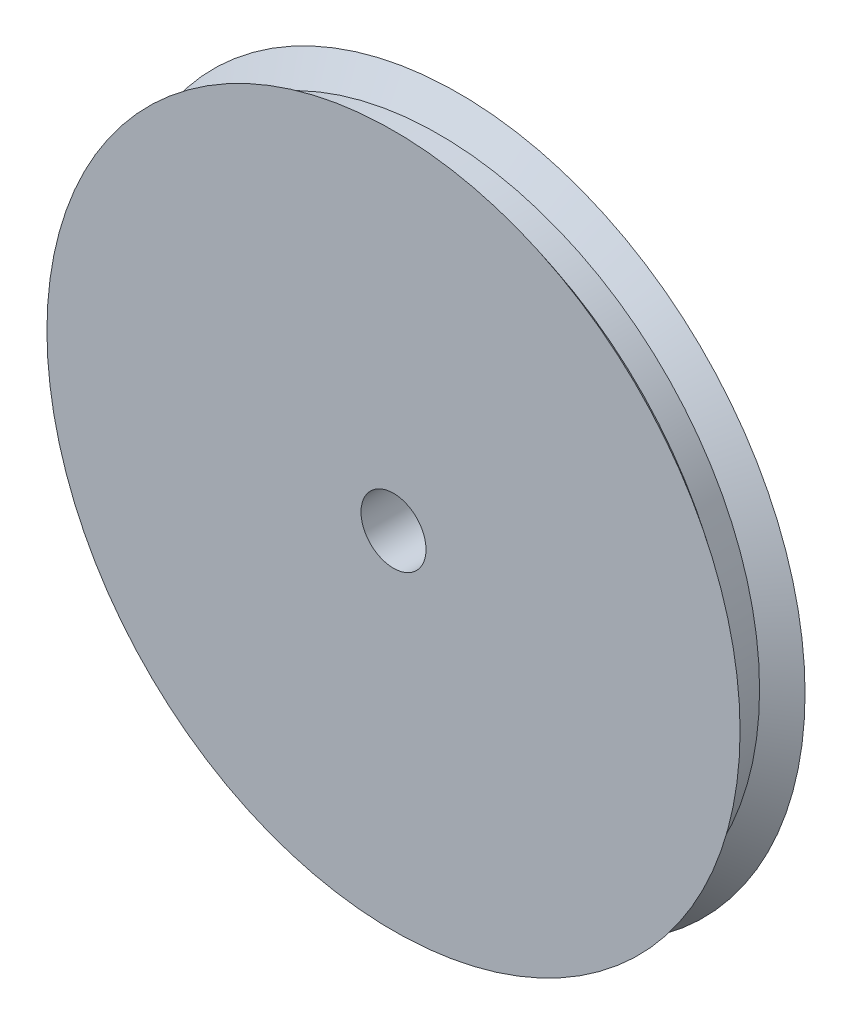
ISO-10303-21;
HEADER;
FILE_DESCRIPTION(('STEP AP214'),'2;1');
FILE_NAME('part.step','',(''),(''),'','','');
FILE_SCHEMA(('AUTOMOTIVE_DESIGN { 1 0 10303 214 1 1 1 1 }'));
ENDSEC;
DATA;
#1=APPLICATION_CONTEXT('core data for automotive mechanical design processes');
#2=APPLICATION_PROTOCOL_DEFINITION('international standard','automotive_design',2000,#1);
#3=PRODUCT_CONTEXT('',#1,'mechanical');
#4=PRODUCT('Part','Part','',(#3));
#5=PRODUCT_RELATED_PRODUCT_CATEGORY('part','',(#4));
#6=PRODUCT_DEFINITION_FORMATION('','',#4);
#7=PRODUCT_DEFINITION_CONTEXT('part definition',#1,'design');
#8=PRODUCT_DEFINITION('design','',#6,#7);
#9=PRODUCT_DEFINITION_SHAPE('','',#8);
#10=(LENGTH_UNIT() NAMED_UNIT(*) SI_UNIT(.MILLI.,.METRE.));
#11=(NAMED_UNIT(*) PLANE_ANGLE_UNIT() SI_UNIT($,.RADIAN.));
#12=(NAMED_UNIT(*) SI_UNIT($,.STERADIAN.) SOLID_ANGLE_UNIT());
#13=UNCERTAINTY_MEASURE_WITH_UNIT(LENGTH_MEASURE(1.E-05),#10,'distance_accuracy_value','');
#14=(GEOMETRIC_REPRESENTATION_CONTEXT(3) GLOBAL_UNCERTAINTY_ASSIGNED_CONTEXT((#13)) GLOBAL_UNIT_ASSIGNED_CONTEXT((#10,
#11,#12)) REPRESENTATION_CONTEXT('',''));
#15=CARTESIAN_POINT('',(0.,0.,0.));
#16=DIRECTION('',(0.,0.,1.));
#17=DIRECTION('',(1.,0.,0.));
#18=AXIS2_PLACEMENT_3D('',#15,#16,#17);
#19=CARTESIAN_POINT('',(0.,0.,0.));
#20=DIRECTION('',(0.,0.,1.));
#21=DIRECTION('',(1.,0.,0.));
#22=AXIS2_PLACEMENT_3D('',#19,#20,#21);
#23=PLANE('',#22);
#24=CARTESIAN_POINT('',(0.,0.,0.));
#25=DIRECTION('',(0.,0.,-1.));
#26=DIRECTION('',(-1.,0.,0.));
#27=AXIS2_PLACEMENT_3D('',#24,#25,#26);
#28=CIRCLE('',#27,101.6);
#29=CARTESIAN_POINT('',(-101.6,0.,0.));
#30=VERTEX_POINT('',#29);
#31=EDGE_CURVE('E40',#30,#30,#28,.T.);
#32=ORIENTED_EDGE('',*,*,#31,.T.);
#33=EDGE_LOOP('',(#32));
#34=FACE_BOUND('',#33,.T.);
#35=CARTESIAN_POINT('',(0.,0.,0.));
#36=DIRECTION('',(0.,0.,1.));
#37=DIRECTION('',(1.,0.,0.));
#38=AXIS2_PLACEMENT_3D('',#35,#36,#37);
#39=CIRCLE('',#38,15.24);
#40=CARTESIAN_POINT('',(15.24,0.,0.));
#41=VERTEX_POINT('',#40);
#42=EDGE_CURVE('E10',#41,#41,#39,.F.);
#43=ORIENTED_EDGE('',*,*,#42,.F.);
#44=EDGE_LOOP('',(#43));
#45=FACE_BOUND('',#44,.T.);
#46=ADVANCED_FACE('F30',(#34,#45),#23,.F.);
#47=CARTESIAN_POINT('',(0.,0.,19.05));
#48=DIRECTION('',(0.,0.,1.));
#49=DIRECTION('',(1.,0.,0.));
#50=AXIS2_PLACEMENT_3D('',#47,#48,#49);
#51=PLANE('',#50);
#52=CARTESIAN_POINT('',(0.,0.,19.05));
#53=DIRECTION('',(0.,0.,-1.));
#54=DIRECTION('',(-1.,0.,0.));
#55=AXIS2_PLACEMENT_3D('',#52,#53,#54);
#56=CIRCLE('',#55,101.6);
#57=CARTESIAN_POINT('',(-101.6,0.,19.05));
#58=VERTEX_POINT('',#57);
#59=EDGE_CURVE('E44',#58,#58,#56,.T.);
#60=ORIENTED_EDGE('',*,*,#59,.F.);
#61=EDGE_LOOP('',(#60));
#62=FACE_BOUND('',#61,.T.);
#63=CARTESIAN_POINT('',(0.,0.,19.05));
#64=DIRECTION('',(0.,0.,1.));
#65=DIRECTION('',(1.,0.,0.));
#66=AXIS2_PLACEMENT_3D('',#63,#64,#65);
#67=CIRCLE('',#66,9.525);
#68=CARTESIAN_POINT('',(9.525,0.,19.05));
#69=VERTEX_POINT('',#68);
#70=EDGE_CURVE('E36',#69,#69,#67,.T.);
#71=ORIENTED_EDGE('',*,*,#70,.F.);
#72=EDGE_LOOP('',(#71));
#73=FACE_BOUND('',#72,.T.);
#74=ADVANCED_FACE('F102',(#62,#73),#51,.T.);
#75=CARTESIAN_POINT('',(0.,0.,19.05));
#76=DIRECTION('',(0.,0.,-1.));
#77=DIRECTION('',(-1.,0.,0.));
#78=AXIS2_PLACEMENT_3D('',#75,#76,#77);
#79=CYLINDRICAL_SURFACE('',#78,9.525);
#80=CARTESIAN_POINT('',(9.52500000000003,0.,-4.445));
#81=CARTESIAN_POINT('',(9.52499895696519,0.0709986106499954,-4.44499700933611));
#82=CARTESIAN_POINT('',(9.52419780911769,0.142040596840437,-4.43902621339383));
#83=CARTESIAN_POINT('',(9.52107894565584,0.28214493046268,-4.41530336835353));
#84=CARTESIAN_POINT('',(9.51875968000494,0.351205179181478,-4.39753927774031));
#85=CARTESIAN_POINT('',(9.51286565704157,0.485297678518134,-4.35076490936118));
#86=CARTESIAN_POINT('',(9.50929177773968,0.550332708742143,-4.32176249499059));
#87=CARTESIAN_POINT('',(9.50128520529349,0.674601073344239,-4.25335260973301));
#88=CARTESIAN_POINT('',(9.49685265064689,0.73383534102401,-4.2139468164593));
#89=CARTESIAN_POINT('',(9.48759211691627,0.845201397290471,-4.12558657888135));
#90=CARTESIAN_POINT('',(9.48276207432941,0.897291820789873,-4.07658021041962));
#91=CARTESIAN_POINT('',(9.47326742349298,0.992535071524196,-3.97052152993633));
#92=CARTESIAN_POINT('',(9.46860282401087,1.03568742568235,-3.91346879230266));
#93=CARTESIAN_POINT('',(9.4599470150452,1.11198597940756,-3.79266505692991));
#94=CARTESIAN_POINT('',(9.45595846781259,1.14509300751437,-3.72888911162608));
#95=CARTESIAN_POINT('',(9.44913392985812,1.20011091579629,-3.59662027230464));
#96=CARTESIAN_POINT('',(9.44629788950517,1.22202227810751,-3.52812758155565));
#97=CARTESIAN_POINT('',(9.44211939721104,1.2539002530033,-3.38880081033145));
#98=CARTESIAN_POINT('',(9.44076817310036,1.26393704685102,-3.3179830550716));
#99=CARTESIAN_POINT('',(9.43968553771915,1.27199822148054,-3.17565647595022));
#100=CARTESIAN_POINT('',(9.43995405261954,1.27002314977337,-3.10414768373508));
#101=CARTESIAN_POINT('',(9.44207252915848,1.25417418671414,-2.96296008243226));
#102=CARTESIAN_POINT('',(9.44391218035188,1.24037786932669,-2.89327238852258));
#103=CARTESIAN_POINT('',(9.44894956011963,1.20139920142826,-2.75721010865734));
#104=CARTESIAN_POINT('',(9.45214731965871,1.17621659131025,-2.69083559828057));
#105=CARTESIAN_POINT('',(9.45955220805502,1.11509765005926,-2.56304438196093));
#106=CARTESIAN_POINT('',(9.46376246768676,1.07912787675231,-2.50164385929162));
#107=CARTESIAN_POINT('',(9.47271559999658,0.997479547736237,-2.38572098298229));
#108=CARTESIAN_POINT('',(9.47745850036341,0.951800487190145,-2.3311989872281));
#109=CARTESIAN_POINT('',(9.48698826013327,0.851601611667402,-2.2301307870105));
#110=CARTESIAN_POINT('',(9.4917751714866,0.797014983961793,-2.18365079988402));
#111=CARTESIAN_POINT('',(9.50081871624597,0.680779798034714,-2.10050250147047));
#112=CARTESIAN_POINT('',(9.50507534812444,0.619131219470905,-2.06383421844756));
#113=CARTESIAN_POINT('',(9.51258190027173,0.490469059528849,-2.00134911026384));
#114=CARTESIAN_POINT('',(9.51583140777688,0.423453292564182,-1.97553673278559));
#115=CARTESIAN_POINT('',(9.52095394449085,0.285985536953519,-1.93555028245256));
#116=CARTESIAN_POINT('',(9.52282704708105,0.215533731709334,-1.92137558914398));
#117=CARTESIAN_POINT('',(9.52497613274304,0.0737659836117845,-1.90515339519034));
#118=CARTESIAN_POINT('',(9.52526412094144,0.00246064693737275,-1.90301473486749));
#119=CARTESIAN_POINT('',(9.5242430262696,-0.139491476933885,-1.91068430672076));
#120=CARTESIAN_POINT('',(9.5229339822156,-0.210138280094496,-1.9204922485318));
#121=CARTESIAN_POINT('',(9.51887336352394,-0.348496709388815,-1.95170085489883));
#122=CARTESIAN_POINT('',(9.51612723582355,-0.416218380485148,-1.97305775588456));
#123=CARTESIAN_POINT('',(9.50949970876473,-0.54711923773391,-2.02671233337005));
#124=CARTESIAN_POINT('',(9.50561826609044,-0.610298250454929,-2.05901042731841));
#125=CARTESIAN_POINT('',(9.49712246729997,-0.730725537921209,-2.1338490187954));
#126=CARTESIAN_POINT('',(9.49250397054029,-0.787937092141843,-2.17644812722797));
#127=CARTESIAN_POINT('',(9.48306287730839,-0.894431121339854,-2.2705970140574));
#128=CARTESIAN_POINT('',(9.47824027157794,-0.943713236156103,-2.32214719879793));
#129=CARTESIAN_POINT('',(9.46889713070679,-1.03327548883667,-2.43313784557611));
#130=CARTESIAN_POINT('',(9.46437876472314,-1.07349498031676,-2.49262745487873));
#131=CARTESIAN_POINT('',(9.45619224456154,-1.14337052935047,-2.61757122552839));
#132=CARTESIAN_POINT('',(9.45252407139858,-1.1730268227907,-2.68302525364309));
#133=CARTESIAN_POINT('',(9.4464683548035,-1.22083726177974,-2.81784884868758));
#134=CARTESIAN_POINT('',(9.444077087377,-1.23902488317715,-2.88720637010886));
#135=CARTESIAN_POINT('',(9.44083550423415,-1.26348913636414,-3.02802520640176));
#136=CARTESIAN_POINT('',(9.43998510609402,-1.26976640526006,-3.09948640853602));
#137=CARTESIAN_POINT('',(9.43992416872609,-1.2702189848693,-3.24188041669198));
#138=CARTESIAN_POINT('',(9.440700716494,-1.26448959188503,-3.31281293301229));
#139=CARTESIAN_POINT('',(9.44377831760116,-1.24129404196048,-3.45269685069096));
#140=CARTESIAN_POINT('',(9.44607937036908,-1.22382788941876,-3.52164825279175));
#141=CARTESIAN_POINT('',(9.45194255323205,-1.17768567060952,-3.65559573886476));
#142=CARTESIAN_POINT('',(9.45550409288719,-1.14901485220091,-3.72059365805921));
#143=CARTESIAN_POINT('',(9.46348784027642,-1.08128652652433,-3.84487158622955));
#144=CARTESIAN_POINT('',(9.46791006462843,-1.04222881870322,-3.90415148477009));
#145=CARTESIAN_POINT('',(9.47715889161244,-0.954484048035378,-4.01579692770454));
#146=CARTESIAN_POINT('',(9.48198831153842,-0.905726072890822,-4.06810651182451));
#147=CARTESIAN_POINT('',(9.49148291566056,-0.800113775371381,-4.16383674238958));
#148=CARTESIAN_POINT('',(9.49614806106301,-0.743257556363409,-4.20725530070641));
#149=CARTESIAN_POINT('',(9.50481103312331,-0.622778147286544,-4.28413363292624));
#150=CARTESIAN_POINT('',(9.50880588981075,-0.55912678417242,-4.31754957326258));
#151=CARTESIAN_POINT('',(9.51564848618447,-0.427096180087956,-4.37316918007612));
#152=CARTESIAN_POINT('',(9.51849745346939,-0.358722091145881,-4.39538485197679));
#153=CARTESIAN_POINT('',(9.52205183306974,-0.241673639142497,-4.42274198405459));
#154=CARTESIAN_POINT('',(9.52315191908271,-0.19373283704192,-4.43107650963751));
#155=CARTESIAN_POINT('',(9.5246263564164,-0.0972014639762312,-4.44220651699508));
#156=CARTESIAN_POINT('',(9.52500071413881,-0.0486108987465377,-4.44500204762964));
#157=CARTESIAN_POINT('',(9.52500000000003,0.,-4.445));
#158=B_SPLINE_CURVE_WITH_KNOTS('',3,(#80,#81,#82,#83,#84,#85,#86,#87,#88,#89,#90,#91,#92,#93,
#94,#95,#96,#97,#98,#99,#100,#101,#102,#103,#104,#105,#106,#107,#108,#109,#110,#111,#112,#113,
#114,#115,#116,#117,#118,#119,#120,#121,#122,#123,#124,#125,#126,#127,#128,#129,#130,#131,#132,
#133,#134,#135,#136,#137,#138,#139,#140,#141,#142,#143,#144,#145,#146,#147,#148,#149,#150,#151,
#152,#153,#154,#155,#156,#157),.UNSPECIFIED.,.T.,.F.,(4,2,2,2,2,2,2,2,2,2,2,2,2,2,2,2,2,2,2,2,2,
2,2,2,2,2,2,2,2,2,2,2,2,2,2,2,2,2,4),(0.,0.212818250579147,0.425854133612003,0.638741224945402,
0.851594007781619,1.0656314631166,1.27968024419571,1.49455328159896,1.7094170648154,
1.92300451005618,2.13658221987324,2.34876902037258,2.56096065896665,2.77381705292565,
2.98668451711811,3.20122895747879,3.41577401586208,3.63040688828612,3.84502831698757,
4.05802201469959,4.27101053565094,4.48319755756754,4.69539267614752,4.90882479478876,
5.12226660494314,5.33709692380011,5.55192244498386,5.76611797457013,5.98030204612608,
6.19279258960356,6.40528305344653,6.61767411351165,6.83006927478398,7.04407829075293,
7.25813751094487,7.47312149438318,7.68787454670186,7.83358694295041,7.97929805385254),.UNSPECIFIED.);
#159=CARTESIAN_POINT('',(9.52500000000003,0.,-4.445));
#160=VERTEX_POINT('',#159);
#161=EDGE_CURVE('E61',#160,#160,#158,.T.);
#162=ORIENTED_EDGE('',*,*,#161,.T.);
#163=EDGE_LOOP('',(#162));
#164=FACE_BOUND('',#163,.T.);
#165=ORIENTED_EDGE('',*,*,#70,.T.);
#166=EDGE_LOOP('',(#165));
#167=FACE_BOUND('',#166,.T.);
#168=CARTESIAN_POINT('',(0.,0.,-6.35));
#169=DIRECTION('',(0.,0.,-1.));
#170=DIRECTION('',(-1.,0.,0.));
#171=AXIS2_PLACEMENT_3D('',#168,#169,#170);
#172=CIRCLE('',#171,9.525);
#173=CARTESIAN_POINT('',(-9.525,0.,-6.35));
#174=VERTEX_POINT('',#173);
#175=EDGE_CURVE('E58',#174,#174,#172,.T.);
#176=ORIENTED_EDGE('',*,*,#175,.T.);
#177=EDGE_LOOP('',(#176));
#178=FACE_BOUND('',#177,.T.);
#179=ADVANCED_FACE('F99',(#164,#167,#178),#79,.F.);
#180=CARTESIAN_POINT('',(0.,0.,0.));
#181=DIRECTION('',(0.,0.,-1.));
#182=DIRECTION('',(-1.,0.,0.));
#183=AXIS2_PLACEMENT_3D('',#180,#181,#182);
#184=CONICAL_SURFACE('',#183,101.6,0.927295218001612);
#185=CARTESIAN_POINT('',(0.,0.,5.715));
#186=DIRECTION('',(0.,0.,-1.));
#187=DIRECTION('',(-1.,0.,0.));
#188=AXIS2_PLACEMENT_3D('',#185,#186,#187);
#189=CIRCLE('',#188,93.98);
#190=CARTESIAN_POINT('',(-93.98,0.,5.715));
#191=VERTEX_POINT('',#190);
#192=EDGE_CURVE('E52',#191,#191,#189,.T.);
#193=ORIENTED_EDGE('',*,*,#192,.T.);
#194=EDGE_LOOP('',(#193));
#195=FACE_BOUND('',#194,.T.);
#196=ORIENTED_EDGE('',*,*,#31,.F.);
#197=EDGE_LOOP('',(#196));
#198=FACE_BOUND('',#197,.T.);
#199=ADVANCED_FACE('F95',(#195,#198),#184,.T.);
#200=CARTESIAN_POINT('',(0.,0.,19.05));
#201=DIRECTION('',(0.,0.,1.));
#202=DIRECTION('',(1.,0.,0.));
#203=AXIS2_PLACEMENT_3D('',#200,#201,#202);
#204=CONICAL_SURFACE('',#203,101.6,0.927295218001612);
#205=CARTESIAN_POINT('',(0.,0.,13.335));
#206=DIRECTION('',(0.,0.,-1.));
#207=DIRECTION('',(-1.,0.,0.));
#208=AXIS2_PLACEMENT_3D('',#205,#206,#207);
#209=CIRCLE('',#208,93.98);
#210=CARTESIAN_POINT('',(-93.98,0.,13.335));
#211=VERTEX_POINT('',#210);
#212=EDGE_CURVE('E49',#211,#211,#209,.T.);
#213=ORIENTED_EDGE('',*,*,#212,.F.);
#214=EDGE_LOOP('',(#213));
#215=FACE_BOUND('',#214,.T.);
#216=ORIENTED_EDGE('',*,*,#59,.T.);
#217=EDGE_LOOP('',(#216));
#218=FACE_BOUND('',#217,.T.);
#219=ADVANCED_FACE('F91',(#215,#218),#204,.T.);
#220=CARTESIAN_POINT('',(0.,0.,0.));
#221=DIRECTION('',(0.,0.,-1.));
#222=DIRECTION('',(-1.,0.,0.));
#223=AXIS2_PLACEMENT_3D('',#220,#221,#222);
#224=CYLINDRICAL_SURFACE('',#223,93.98);
#225=ORIENTED_EDGE('',*,*,#192,.F.);
#226=EDGE_LOOP('',(#225));
#227=FACE_BOUND('',#226,.T.);
#228=ORIENTED_EDGE('',*,*,#212,.T.);
#229=EDGE_LOOP('',(#228));
#230=FACE_BOUND('',#229,.T.);
#231=ADVANCED_FACE('F84',(#227,#230),#224,.T.);
#232=CARTESIAN_POINT('',(0.,0.,-6.35));
#233=DIRECTION('',(0.,0.,-1.));
#234=DIRECTION('',(-1.,0.,0.));
#235=AXIS2_PLACEMENT_3D('',#232,#233,#234);
#236=PLANE('',#235);
#237=CARTESIAN_POINT('',(0.,0.,-6.35));
#238=DIRECTION('',(0.,0.,-1.));
#239=DIRECTION('',(-1.,0.,0.));
#240=AXIS2_PLACEMENT_3D('',#237,#238,#239);
#241=CIRCLE('',#240,15.24);
#242=CARTESIAN_POINT('',(-15.24,0.,-6.35));
#243=VERTEX_POINT('',#242);
#244=EDGE_CURVE('E55',#243,#243,#241,.T.);
#245=ORIENTED_EDGE('',*,*,#244,.T.);
#246=EDGE_LOOP('',(#245));
#247=FACE_BOUND('',#246,.T.);
#248=ORIENTED_EDGE('',*,*,#175,.F.);
#249=EDGE_LOOP('',(#248));
#250=FACE_BOUND('',#249,.T.);
#251=ADVANCED_FACE('F80',(#247,#250),#236,.T.);
#252=CARTESIAN_POINT('',(0.,0.,-6.35));
#253=DIRECTION('',(0.,0.,1.));
#254=DIRECTION('',(1.,0.,0.));
#255=AXIS2_PLACEMENT_3D('',#252,#253,#254);
#256=CYLINDRICAL_SURFACE('',#255,15.24);
#257=CARTESIAN_POINT('',(15.24,0.,-4.445));
#258=CARTESIAN_POINT('',(15.2399993067263,0.0712039341999295,-4.44499688999063));
#259=CARTESIAN_POINT('',(15.2394956645011,0.142456340918887,-4.43899166833997));
#260=CARTESIAN_POINT('',(15.2375349595688,0.282989744789495,-4.41512407314405));
#261=CARTESIAN_POINT('',(15.2360768167325,0.352268415636042,-4.39724826631277));
#262=CARTESIAN_POINT('',(15.2323718878255,0.486798648593112,-4.3501600146621));
#263=CARTESIAN_POINT('',(15.2301255480508,0.552052465139262,-4.32095398430053));
#264=CARTESIAN_POINT('',(15.2250961403578,0.676715986438417,-4.25204581152257));
#265=CARTESIAN_POINT('',(15.2223131872832,0.736126937554444,-4.21234591428356));
#266=CARTESIAN_POINT('',(15.2165149043072,0.847585299956301,-4.12346766541039));
#267=CARTESIAN_POINT('',(15.2134990634995,0.899615767968525,-4.07426809740168));
#268=CARTESIAN_POINT('',(15.2075791962002,0.994690839591424,-3.96783192227058));
#269=CARTESIAN_POINT('',(15.2046751746254,1.03773504844181,-3.91059496225567));
#270=CARTESIAN_POINT('',(15.1993022487978,1.11367306143559,-3.78960619128423));
#271=CARTESIAN_POINT('',(15.1968339849872,1.14655197784846,-3.72584500523848));
#272=CARTESIAN_POINT('',(15.1926178804931,1.20113099089278,-3.5936830646439));
#273=CARTESIAN_POINT('',(15.1908700270845,1.22283128498077,-3.52528239207002));
#274=CARTESIAN_POINT('',(15.1882969292423,1.25438792786959,-3.3859528523109));
#275=CARTESIAN_POINT('',(15.18746953529,1.26427187504501,-3.3150302762094));
#276=CARTESIAN_POINT('',(15.1868242404827,1.27200051417959,-3.17252832098939));
#277=CARTESIAN_POINT('',(15.1870063206823,1.26984543208401,-3.10094895422253));
#278=CARTESIAN_POINT('',(15.1883574484928,1.25357999755286,-2.95935442480164));
#279=CARTESIAN_POINT('',(15.1895240198987,1.23949963940833,-2.88933578967296));
#280=CARTESIAN_POINT('',(15.1927088013309,1.19982994143633,-2.75265912841095));
#281=CARTESIAN_POINT('',(15.1947270196749,1.17424048920392,-2.68600113510681));
#282=CARTESIAN_POINT('',(15.199390539777,1.11224541095308,-2.55784234953482));
#283=CARTESIAN_POINT('',(15.2020366208972,1.07582632784164,-2.49634809646386));
#284=CARTESIAN_POINT('',(15.2076569971713,0.993215493769953,-2.38033389969885));
#285=CARTESIAN_POINT('',(15.2106312989716,0.947023544890628,-2.32581409728654));
#286=CARTESIAN_POINT('',(15.2165839992279,0.846009969427481,-2.22512201751241));
#287=CARTESIAN_POINT('',(15.2195623824433,0.791162412326031,-2.17897574855585));
#288=CARTESIAN_POINT('',(15.2251789967469,0.674485006592124,-2.09654175129654));
#289=CARTESIAN_POINT('',(15.2278172276077,0.612655153294479,-2.06025402958078));
#290=CARTESIAN_POINT('',(15.2324567817824,0.483751373450171,-1.99856882141074));
#291=CARTESIAN_POINT('',(15.2344580377215,0.416676893097524,-1.97317248687274));
#292=CARTESIAN_POINT('',(15.2375973811298,0.279195617654869,-1.93400917178681));
#293=CARTESIAN_POINT('',(15.2387354865128,0.208788891754446,-1.92024194988782));
#294=CARTESIAN_POINT('',(15.2400179951767,0.0668671512085989,-1.90476026966719));
#295=CARTESIAN_POINT('',(15.2401653602484,-0.0046439189762988,-1.90300988700424));
#296=CARTESIAN_POINT('',(15.2394576944895,-0.146942495679195,-1.91151746299669));
#297=CARTESIAN_POINT('',(15.238602673009,-0.217730008940195,-1.92177530964141));
#298=CARTESIAN_POINT('',(15.2359882965848,-0.356469640405368,-1.95397838643482));
#299=CARTESIAN_POINT('',(15.2342302302012,-0.424425649927447,-1.97590696515278));
#300=CARTESIAN_POINT('',(15.2300072604269,-0.555693789654761,-2.03081202648318));
#301=CARTESIAN_POINT('',(15.2275423458608,-0.619005846419578,-2.06378868376629));
#302=CARTESIAN_POINT('',(15.2221746151991,-0.739352367243422,-2.13994409350477));
#303=CARTESIAN_POINT('',(15.219270783378,-0.796371725162266,-2.18314664512143));
#304=CARTESIAN_POINT('',(15.2133548747242,-0.902361790451399,-2.27849310245411));
#305=CARTESIAN_POINT('',(15.2103427960116,-0.951332357954267,-2.33063716351857));
#306=CARTESIAN_POINT('',(15.2045411074409,-1.03995797272798,-2.44254234909189));
#307=CARTESIAN_POINT('',(15.2017520688026,-1.07958957720672,-2.5023220733207));
#308=CARTESIAN_POINT('',(15.1967203271529,-1.14825152980619,-2.62770907383654));
#309=CARTESIAN_POINT('',(15.1944776186868,-1.17728198377265,-2.69331629193162));
#310=CARTESIAN_POINT('',(15.1907956641815,-1.22387763534952,-2.82841292398483));
#311=CARTESIAN_POINT('',(15.1893554128036,-1.2414571836406,-2.8978973597872));
#312=CARTESIAN_POINT('',(15.1874380742738,-1.26469872778589,-3.03884418884052));
#313=CARTESIAN_POINT('',(15.1869609686255,-1.2703609525017,-3.11030654408059));
#314=CARTESIAN_POINT('',(15.1870242099675,-1.26960447487148,-3.25294768004654));
#315=CARTESIAN_POINT('',(15.187561454802,-1.26322260661729,-3.32412666039028));
#316=CARTESIAN_POINT('',(15.1895862715453,-1.23863590638469,-3.46439811760958));
#317=CARTESIAN_POINT('',(15.1910738449035,-1.22043105637409,-3.53349059130268));
#318=CARTESIAN_POINT('',(15.1948308895727,-1.17272448972167,-3.6676301593486));
#319=CARTESIAN_POINT('',(15.1971003149866,-1.1432234361883,-3.73267749089842));
#320=CARTESIAN_POINT('',(15.2021654284134,-1.07376602486301,-3.85690216752856));
#321=CARTESIAN_POINT('',(15.2049611081659,-1.03380983117549,-3.91607960472292));
#322=CARTESIAN_POINT('',(15.2107738925733,-0.944437966495509,-4.02707314854652));
#323=CARTESIAN_POINT('',(15.2137916196729,-0.894995027051654,-4.07886726599483));
#324=CARTESIAN_POINT('',(15.2197027966229,-0.788102596502432,-4.17344248520822));
#325=CARTESIAN_POINT('',(15.2225962162253,-0.730651170954187,-4.21622140306994));
#326=CARTESIAN_POINT('',(15.2279379824969,-0.609261891747357,-4.2916092227303));
#327=CARTESIAN_POINT('',(15.2303854906934,-0.545312163463584,-4.32419904609354));
#328=CARTESIAN_POINT('',(15.234549826957,-0.412871605034582,-4.37813678987512));
#329=CARTESIAN_POINT('',(15.2362674944889,-0.344386097375337,-4.39949763264589));
#330=CARTESIAN_POINT('',(15.2383376682199,-0.229580501082783,-4.4249309297776));
#331=CARTESIAN_POINT('',(15.2389582047373,-0.183998735936858,-4.43244682789721));
#332=CARTESIAN_POINT('',(15.2397895947646,-0.0922847678064764,-4.44248236429005));
#333=CARTESIAN_POINT('',(15.2400004493623,-0.0461525662837672,-4.44500201582841));
#334=CARTESIAN_POINT('',(15.24,0.,-4.445));
#335=B_SPLINE_CURVE_WITH_KNOTS('',3,(#257,#258,#259,#260,#261,#262,#263,#264,#265,#266,#267,
#268,#269,#270,#271,#272,#273,#274,#275,#276,#277,#278,#279,#280,#281,#282,#283,#284,#285,#286,
#287,#288,#289,#290,#291,#292,#293,#294,#295,#296,#297,#298,#299,#300,#301,#302,#303,#304,#305,
#306,#307,#308,#309,#310,#311,#312,#313,#314,#315,#316,#317,#318,#319,#320,#321,#322,#323,#324,
#325,#326,#327,#328,#329,#330,#331,#332,#333,#334),.UNSPECIFIED.,.T.,.F.,(4,2,2,2,2,2,2,2,2,2,2,
2,2,2,2,2,2,2,2,2,2,2,2,2,2,2,2,2,2,2,2,2,2,2,2,2,2,2,4),(0.,0.213443295236177,
0.427128545027251,0.640692995838973,0.854211791171911,1.06821308935792,1.28222378649893,
1.49654644747886,1.71086532258434,1.92468264836115,2.13849596128526,2.35177308550068,
2.56505229275789,2.77859764001102,2.99214731237692,3.2063493268764,3.42055148449479,
3.63477629139872,3.84899665216319,4.06257632120104,4.27615399802061,4.48942776269098,
4.70270489938943,4.91648337218157,5.13026555950488,5.34457880143827,5.55888990353182,
5.77293190395979,5.98696979386423,6.2003541586081,6.41373884880272,6.62711101483354,
6.84047983196517,7.05447139604092,7.26851473945251,7.48295649789443,7.69715093271568,
7.83549977672961,7.97384825342408),.UNSPECIFIED.);
#336=CARTESIAN_POINT('',(15.24,0.,-4.445));
#337=VERTEX_POINT('',#336);
#338=EDGE_CURVE('E68',#337,#337,#335,.T.);
#339=ORIENTED_EDGE('',*,*,#338,.F.);
#340=EDGE_LOOP('',(#339));
#341=FACE_BOUND('',#340,.T.);
#342=ORIENTED_EDGE('',*,*,#244,.F.);
#343=EDGE_LOOP('',(#342));
#344=FACE_BOUND('',#343,.T.);
#345=ORIENTED_EDGE('',*,*,#42,.T.);
#346=EDGE_LOOP('',(#345));
#347=FACE_BOUND('',#346,.T.);
#348=ADVANCED_FACE('F78',(#341,#344,#347),#256,.T.);
#349=CARTESIAN_POINT('',(-101.601,0.,-3.175));
#350=DIRECTION('',(1.,0.,0.));
#351=DIRECTION('',(0.,0.,-1.));
#352=AXIS2_PLACEMENT_3D('',#349,#350,#351);
#353=CYLINDRICAL_SURFACE('',#352,1.27);
#354=ORIENTED_EDGE('',*,*,#161,.F.);
#355=EDGE_LOOP('',(#354));
#356=FACE_BOUND('',#355,.T.);
#357=ORIENTED_EDGE('',*,*,#338,.T.);
#358=EDGE_LOOP('',(#357));
#359=FACE_BOUND('',#358,.T.);
#360=ADVANCED_FACE('F72',(#356,#359),#353,.F.);
#361=CLOSED_SHELL('',(#46,#74,#179,#199,#219,#231,#251,#348,#360));
#362=MANIFOLD_SOLID_BREP('B2',#361);
#363=ADVANCED_BREP_SHAPE_REPRESENTATION('',(#18,#362),#14);
#364=SHAPE_DEFINITION_REPRESENTATION(#9,#363);
ENDSEC;
END-ISO-10303-21;
